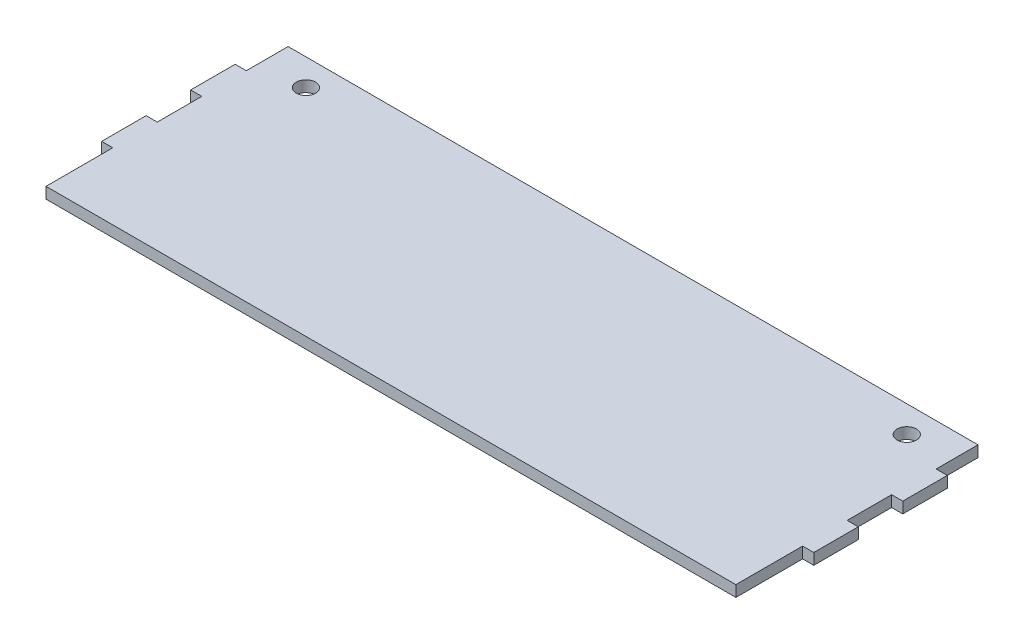
ISO-10303-21;
HEADER;
FILE_DESCRIPTION(('STEP AP214'),'2;1');
FILE_NAME('part.step','',(''),(''),'','','');
FILE_SCHEMA(('AUTOMOTIVE_DESIGN { 1 0 10303 214 1 1 1 1 }'));
ENDSEC;
DATA;
#1=APPLICATION_CONTEXT('core data for automotive mechanical design processes');
#2=APPLICATION_PROTOCOL_DEFINITION('international standard','automotive_design',2000,#1);
#3=PRODUCT_CONTEXT('',#1,'mechanical');
#4=PRODUCT('Part','Part','',(#3));
#5=PRODUCT_RELATED_PRODUCT_CATEGORY('part','',(#4));
#6=PRODUCT_DEFINITION_FORMATION('','',#4);
#7=PRODUCT_DEFINITION_CONTEXT('part definition',#1,'design');
#8=PRODUCT_DEFINITION('design','',#6,#7);
#9=PRODUCT_DEFINITION_SHAPE('','',#8);
#10=(LENGTH_UNIT() NAMED_UNIT(*) SI_UNIT(.MILLI.,.METRE.));
#11=(NAMED_UNIT(*) PLANE_ANGLE_UNIT() SI_UNIT($,.RADIAN.));
#12=(NAMED_UNIT(*) SI_UNIT($,.STERADIAN.) SOLID_ANGLE_UNIT());
#13=UNCERTAINTY_MEASURE_WITH_UNIT(LENGTH_MEASURE(1.E-05),#10,'distance_accuracy_value','');
#14=(GEOMETRIC_REPRESENTATION_CONTEXT(3) GLOBAL_UNCERTAINTY_ASSIGNED_CONTEXT((#13)) GLOBAL_UNIT_ASSIGNED_CONTEXT((#10,
#11,#12)) REPRESENTATION_CONTEXT('',''));
#15=CARTESIAN_POINT('',(0.,0.,0.));
#16=DIRECTION('',(0.,0.,1.));
#17=DIRECTION('',(1.,0.,0.));
#18=AXIS2_PLACEMENT_3D('',#15,#16,#17);
#19=CARTESIAN_POINT('',(0.,3.175,0.));
#20=DIRECTION('',(0.,0.,-1.));
#21=DIRECTION('',(-1.,0.,0.));
#22=AXIS2_PLACEMENT_3D('',#19,#20,#21);
#23=PLANE('',#22);
#24=DIRECTION('',(1.,0.,0.));
#25=VECTOR('',#24,1.);
#26=CARTESIAN_POINT('',(0.,0.,0.));
#27=LINE('',#26,#25);
#28=CARTESIAN_POINT('',(3.175,0.,0.));
#29=VERTEX_POINT('',#28);
#30=CARTESIAN_POINT('',(200.025,0.,0.));
#31=VERTEX_POINT('',#30);
#32=EDGE_CURVE('E245',#29,#31,#27,.T.);
#33=ORIENTED_EDGE('',*,*,#32,.T.);
#34=DIRECTION('',(0.,-1.,0.));
#35=VECTOR('',#34,1.);
#36=CARTESIAN_POINT('',(200.025,3.175,0.));
#37=LINE('',#36,#35);
#38=CARTESIAN_POINT('',(200.025,3.175,0.));
#39=VERTEX_POINT('',#38);
#40=EDGE_CURVE('E11',#39,#31,#37,.T.);
#41=ORIENTED_EDGE('',*,*,#40,.F.);
#42=DIRECTION('',(1.,0.,0.));
#43=VECTOR('',#42,1.);
#44=CARTESIAN_POINT('',(0.,3.175,0.));
#45=LINE('',#44,#43);
#46=CARTESIAN_POINT('',(3.175,3.175,0.));
#47=VERTEX_POINT('',#46);
#48=EDGE_CURVE('E239',#47,#39,#45,.T.);
#49=ORIENTED_EDGE('',*,*,#48,.F.);
#50=DIRECTION('',(0.,-1.,0.));
#51=VECTOR('',#50,1.);
#52=CARTESIAN_POINT('',(3.175,3.175,0.));
#53=LINE('',#52,#51);
#54=EDGE_CURVE('E51',#47,#29,#53,.T.);
#55=ORIENTED_EDGE('',*,*,#54,.T.);
#56=EDGE_LOOP('',(#33,#41,#49,#55));
#57=FACE_BOUND('',#56,.T.);
#58=ADVANCED_FACE('F35',(#57),#23,.F.);
#59=CARTESIAN_POINT('',(200.025,3.175,-5.82867087928207E-13));
#60=DIRECTION('',(-1.,0.,0.));
#61=DIRECTION('',(0.,0.,1.));
#62=AXIS2_PLACEMENT_3D('',#59,#60,#61);
#63=PLANE('',#62);
#64=DIRECTION('',(0.,0.,-1.));
#65=VECTOR('',#64,1.);
#66=CARTESIAN_POINT('',(200.025,0.,-5.82867087928207E-13));
#67=LINE('',#66,#65);
#68=CARTESIAN_POINT('',(200.025,0.,-19.05));
#69=VERTEX_POINT('',#68);
#70=EDGE_CURVE('E287',#31,#69,#67,.T.);
#71=ORIENTED_EDGE('',*,*,#70,.T.);
#72=DIRECTION('',(0.,-1.,0.));
#73=VECTOR('',#72,1.);
#74=CARTESIAN_POINT('',(200.025,3.175,-19.05));
#75=LINE('',#74,#73);
#76=CARTESIAN_POINT('',(200.025,3.175,-19.05));
#77=VERTEX_POINT('',#76);
#78=EDGE_CURVE('E43',#77,#69,#75,.T.);
#79=ORIENTED_EDGE('',*,*,#78,.F.);
#80=DIRECTION('',(0.,0.,-1.));
#81=VECTOR('',#80,1.);
#82=CARTESIAN_POINT('',(200.025,3.175,-5.82867087928207E-13));
#83=LINE('',#82,#81);
#84=EDGE_CURVE('E126',#39,#77,#83,.T.);
#85=ORIENTED_EDGE('',*,*,#84,.F.);
#86=ORIENTED_EDGE('',*,*,#40,.T.);
#87=EDGE_LOOP('',(#71,#79,#85,#86));
#88=FACE_BOUND('',#87,.T.);
#89=ADVANCED_FACE('F279',(#88),#63,.F.);
#90=CARTESIAN_POINT('',(0.,3.175,-19.05));
#91=DIRECTION('',(0.,0.,1.));
#92=DIRECTION('',(1.,0.,0.));
#93=AXIS2_PLACEMENT_3D('',#90,#91,#92);
#94=PLANE('',#93);
#95=DIRECTION('',(-1.,0.,0.));
#96=VECTOR('',#95,1.);
#97=CARTESIAN_POINT('',(0.,0.,-19.05));
#98=LINE('',#97,#96);
#99=CARTESIAN_POINT('',(203.2,0.,-19.05));
#100=VERTEX_POINT('',#99);
#101=EDGE_CURVE('E290',#100,#69,#98,.T.);
#102=ORIENTED_EDGE('',*,*,#101,.F.);
#103=DIRECTION('',(0.,-1.,0.));
#104=VECTOR('',#103,1.);
#105=CARTESIAN_POINT('',(203.2,3.175,-19.05));
#106=LINE('',#105,#104);
#107=CARTESIAN_POINT('',(203.2,3.175,-19.05));
#108=VERTEX_POINT('',#107);
#109=EDGE_CURVE('E369',#108,#100,#106,.T.);
#110=ORIENTED_EDGE('',*,*,#109,.F.);
#111=DIRECTION('',(-1.,0.,0.));
#112=VECTOR('',#111,1.);
#113=CARTESIAN_POINT('',(0.,3.175,-19.05));
#114=LINE('',#113,#112);
#115=EDGE_CURVE('E235',#108,#77,#114,.T.);
#116=ORIENTED_EDGE('',*,*,#115,.T.);
#117=ORIENTED_EDGE('',*,*,#78,.T.);
#118=EDGE_LOOP('',(#102,#110,#116,#117));
#119=FACE_BOUND('',#118,.T.);
#120=ADVANCED_FACE('F283',(#119),#94,.T.);
#121=CARTESIAN_POINT('',(203.2,3.175,0.));
#122=DIRECTION('',(-1.,0.,0.));
#123=DIRECTION('',(0.,0.,1.));
#124=AXIS2_PLACEMENT_3D('',#121,#122,#123);
#125=PLANE('',#124);
#126=DIRECTION('',(0.,0.,-1.));
#127=VECTOR('',#126,1.);
#128=CARTESIAN_POINT('',(203.2,0.,0.));
#129=LINE('',#128,#127);
#130=CARTESIAN_POINT('',(203.2,0.,-31.75));
#131=VERTEX_POINT('',#130);
#132=EDGE_CURVE('E296',#100,#131,#129,.T.);
#133=ORIENTED_EDGE('',*,*,#132,.T.);
#134=DIRECTION('',(0.,-1.,0.));
#135=VECTOR('',#134,1.);
#136=CARTESIAN_POINT('',(203.2,3.175,-31.75));
#137=LINE('',#136,#135);
#138=CARTESIAN_POINT('',(203.2,3.175,-31.75));
#139=VERTEX_POINT('',#138);
#140=EDGE_CURVE('E366',#139,#131,#137,.T.);
#141=ORIENTED_EDGE('',*,*,#140,.F.);
#142=DIRECTION('',(0.,0.,-1.));
#143=VECTOR('',#142,1.);
#144=CARTESIAN_POINT('',(203.2,3.175,0.));
#145=LINE('',#144,#143);
#146=EDGE_CURVE('E233',#108,#139,#145,.T.);
#147=ORIENTED_EDGE('',*,*,#146,.F.);
#148=ORIENTED_EDGE('',*,*,#109,.T.);
#149=EDGE_LOOP('',(#133,#141,#147,#148));
#150=FACE_BOUND('',#149,.T.);
#151=ADVANCED_FACE('F378',(#150),#125,.F.);
#152=CARTESIAN_POINT('',(0.,3.175,-31.7499999999996));
#153=DIRECTION('',(0.,0.,1.));
#154=DIRECTION('',(1.,0.,0.));
#155=AXIS2_PLACEMENT_3D('',#152,#153,#154);
#156=PLANE('',#155);
#157=DIRECTION('',(-1.,0.,0.));
#158=VECTOR('',#157,1.);
#159=CARTESIAN_POINT('',(0.,0.,-31.7499999999996));
#160=LINE('',#159,#158);
#161=CARTESIAN_POINT('',(200.025,0.,-31.75));
#162=VERTEX_POINT('',#161);
#163=EDGE_CURVE('E298',#131,#162,#160,.T.);
#164=ORIENTED_EDGE('',*,*,#163,.T.);
#165=DIRECTION('',(0.,-1.,0.));
#166=VECTOR('',#165,1.);
#167=CARTESIAN_POINT('',(200.025,3.175,-31.75));
#168=LINE('',#167,#166);
#169=CARTESIAN_POINT('',(200.025,3.175,-31.75));
#170=VERTEX_POINT('',#169);
#171=EDGE_CURVE('E363',#170,#162,#168,.T.);
#172=ORIENTED_EDGE('',*,*,#171,.F.);
#173=DIRECTION('',(-1.,0.,0.));
#174=VECTOR('',#173,1.);
#175=CARTESIAN_POINT('',(0.,3.175,-31.7499999999996));
#176=LINE('',#175,#174);
#177=EDGE_CURVE('E231',#139,#170,#176,.T.);
#178=ORIENTED_EDGE('',*,*,#177,.F.);
#179=ORIENTED_EDGE('',*,*,#140,.T.);
#180=EDGE_LOOP('',(#164,#172,#178,#179));
#181=FACE_BOUND('',#180,.T.);
#182=ADVANCED_FACE('F382',(#181),#156,.F.);
#183=CARTESIAN_POINT('',(200.025,3.175,0.));
#184=DIRECTION('',(-1.,0.,0.));
#185=DIRECTION('',(0.,0.,1.));
#186=AXIS2_PLACEMENT_3D('',#183,#184,#185);
#187=PLANE('',#186);
#188=DIRECTION('',(0.,0.,-1.));
#189=VECTOR('',#188,1.);
#190=CARTESIAN_POINT('',(200.025,0.,0.));
#191=LINE('',#190,#189);
#192=CARTESIAN_POINT('',(200.025,0.,-44.45));
#193=VERTEX_POINT('',#192);
#194=EDGE_CURVE('E301',#162,#193,#191,.T.);
#195=ORIENTED_EDGE('',*,*,#194,.T.);
#196=DIRECTION('',(0.,-1.,0.));
#197=VECTOR('',#196,1.);
#198=CARTESIAN_POINT('',(200.025,3.175,-44.45));
#199=LINE('',#198,#197);
#200=CARTESIAN_POINT('',(200.025,3.175,-44.45));
#201=VERTEX_POINT('',#200);
#202=EDGE_CURVE('E361',#201,#193,#199,.T.);
#203=ORIENTED_EDGE('',*,*,#202,.F.);
#204=DIRECTION('',(0.,0.,-1.));
#205=VECTOR('',#204,1.);
#206=CARTESIAN_POINT('',(200.025,3.175,0.));
#207=LINE('',#206,#205);
#208=EDGE_CURVE('E229',#170,#201,#207,.T.);
#209=ORIENTED_EDGE('',*,*,#208,.F.);
#210=ORIENTED_EDGE('',*,*,#171,.T.);
#211=EDGE_LOOP('',(#195,#203,#209,#210));
#212=FACE_BOUND('',#211,.T.);
#213=ADVANCED_FACE('F435',(#212),#187,.F.);
#214=CARTESIAN_POINT('',(0.,3.175,-44.4499999999996));
#215=DIRECTION('',(0.,0.,1.));
#216=DIRECTION('',(1.,0.,0.));
#217=AXIS2_PLACEMENT_3D('',#214,#215,#216);
#218=PLANE('',#217);
#219=DIRECTION('',(-1.,0.,0.));
#220=VECTOR('',#219,1.);
#221=CARTESIAN_POINT('',(0.,0.,-44.4499999999996));
#222=LINE('',#221,#220);
#223=CARTESIAN_POINT('',(203.2,0.,-44.45));
#224=VERTEX_POINT('',#223);
#225=EDGE_CURVE('E304',#224,#193,#222,.T.);
#226=ORIENTED_EDGE('',*,*,#225,.F.);
#227=DIRECTION('',(0.,-1.,0.));
#228=VECTOR('',#227,1.);
#229=CARTESIAN_POINT('',(203.2,3.175,-44.45));
#230=LINE('',#229,#228);
#231=CARTESIAN_POINT('',(203.2,3.175,-44.45));
#232=VERTEX_POINT('',#231);
#233=EDGE_CURVE('E359',#232,#224,#230,.T.);
#234=ORIENTED_EDGE('',*,*,#233,.F.);
#235=DIRECTION('',(-1.,0.,0.));
#236=VECTOR('',#235,1.);
#237=CARTESIAN_POINT('',(0.,3.175,-44.4499999999996));
#238=LINE('',#237,#236);
#239=EDGE_CURVE('E226',#232,#201,#238,.T.);
#240=ORIENTED_EDGE('',*,*,#239,.T.);
#241=ORIENTED_EDGE('',*,*,#202,.T.);
#242=EDGE_LOOP('',(#226,#234,#240,#241));
#243=FACE_BOUND('',#242,.T.);
#244=ADVANCED_FACE('F431',(#243),#218,.T.);
#245=CARTESIAN_POINT('',(203.2,0.,-57.15));
#246=VERTEX_POINT('',#245);
#247=EDGE_CURVE('E299',#224,#246,#129,.T.);
#248=ORIENTED_EDGE('',*,*,#247,.T.);
#249=DIRECTION('',(0.,-1.,0.));
#250=VECTOR('',#249,1.);
#251=CARTESIAN_POINT('',(203.2,3.175,-57.15));
#252=LINE('',#251,#250);
#253=CARTESIAN_POINT('',(203.2,3.175,-57.15));
#254=VERTEX_POINT('',#253);
#255=EDGE_CURVE('E356',#254,#246,#252,.T.);
#256=ORIENTED_EDGE('',*,*,#255,.F.);
#257=EDGE_CURVE('E225',#232,#254,#145,.T.);
#258=ORIENTED_EDGE('',*,*,#257,.F.);
#259=ORIENTED_EDGE('',*,*,#233,.T.);
#260=EDGE_LOOP('',(#248,#256,#258,#259));
#261=FACE_BOUND('',#260,.T.);
#262=ADVANCED_FACE('F427',(#261),#125,.F.);
#263=CARTESIAN_POINT('',(-1.24900090270329E-13,3.175,-57.1499999999996));
#264=DIRECTION('',(0.,0.,1.));
#265=DIRECTION('',(1.,0.,0.));
#266=AXIS2_PLACEMENT_3D('',#263,#264,#265);
#267=PLANE('',#266);
#268=DIRECTION('',(-1.,0.,0.));
#269=VECTOR('',#268,1.);
#270=CARTESIAN_POINT('',(-1.24900090270329E-13,0.,-57.1499999999996));
#271=LINE('',#270,#269);
#272=CARTESIAN_POINT('',(200.025,0.,-57.15));
#273=VERTEX_POINT('',#272);
#274=EDGE_CURVE('E307',#246,#273,#271,.T.);
#275=ORIENTED_EDGE('',*,*,#274,.T.);
#276=DIRECTION('',(0.,-1.,0.));
#277=VECTOR('',#276,1.);
#278=CARTESIAN_POINT('',(200.025,3.175,-57.15));
#279=LINE('',#278,#277);
#280=CARTESIAN_POINT('',(200.025,3.175,-57.15));
#281=VERTEX_POINT('',#280);
#282=EDGE_CURVE('E353',#281,#273,#279,.T.);
#283=ORIENTED_EDGE('',*,*,#282,.F.);
#284=DIRECTION('',(-1.,0.,0.));
#285=VECTOR('',#284,1.);
#286=CARTESIAN_POINT('',(-1.24900090270329E-13,3.175,-57.1499999999996));
#287=LINE('',#286,#285);
#288=EDGE_CURVE('E223',#254,#281,#287,.T.);
#289=ORIENTED_EDGE('',*,*,#288,.F.);
#290=ORIENTED_EDGE('',*,*,#255,.T.);
#291=EDGE_LOOP('',(#275,#283,#289,#290));
#292=FACE_BOUND('',#291,.T.);
#293=ADVANCED_FACE('F423',(#292),#267,.F.);
#294=CARTESIAN_POINT('',(200.025,3.175,0.));
#295=DIRECTION('',(-1.,0.,0.));
#296=DIRECTION('',(0.,0.,1.));
#297=AXIS2_PLACEMENT_3D('',#294,#295,#296);
#298=PLANE('',#297);
#299=DIRECTION('',(0.,0.,-1.));
#300=VECTOR('',#299,1.);
#301=CARTESIAN_POINT('',(200.025,0.,0.));
#302=LINE('',#301,#300);
#303=CARTESIAN_POINT('',(200.025,0.,-69.088));
#304=VERTEX_POINT('',#303);
#305=EDGE_CURVE('E309',#273,#304,#302,.T.);
#306=ORIENTED_EDGE('',*,*,#305,.T.);
#307=DIRECTION('',(0.,-1.,0.));
#308=VECTOR('',#307,1.);
#309=CARTESIAN_POINT('',(200.025,3.175,-69.088));
#310=LINE('',#309,#308);
#311=CARTESIAN_POINT('',(200.025,3.175,-69.088));
#312=VERTEX_POINT('',#311);
#313=EDGE_CURVE('E351',#312,#304,#310,.T.);
#314=ORIENTED_EDGE('',*,*,#313,.F.);
#315=DIRECTION('',(0.,0.,-1.));
#316=VECTOR('',#315,1.);
#317=CARTESIAN_POINT('',(200.025,3.175,0.));
#318=LINE('',#317,#316);
#319=EDGE_CURVE('E221',#281,#312,#318,.T.);
#320=ORIENTED_EDGE('',*,*,#319,.F.);
#321=ORIENTED_EDGE('',*,*,#282,.T.);
#322=EDGE_LOOP('',(#306,#314,#320,#321));
#323=FACE_BOUND('',#322,.T.);
#324=ADVANCED_FACE('F419',(#323),#298,.F.);
#325=CARTESIAN_POINT('',(0.,3.175,-69.088));
#326=DIRECTION('',(0.,0.,-1.));
#327=DIRECTION('',(-1.,0.,0.));
#328=AXIS2_PLACEMENT_3D('',#325,#326,#327);
#329=PLANE('',#328);
#330=DIRECTION('',(1.,0.,0.));
#331=VECTOR('',#330,1.);
#332=CARTESIAN_POINT('',(0.,0.,-69.088));
#333=LINE('',#332,#331);
#334=CARTESIAN_POINT('',(3.17499999999999,0.,-69.088));
#335=VERTEX_POINT('',#334);
#336=EDGE_CURVE('E312',#335,#304,#333,.T.);
#337=ORIENTED_EDGE('',*,*,#336,.F.);
#338=DIRECTION('',(0.,-1.,0.));
#339=VECTOR('',#338,1.);
#340=CARTESIAN_POINT('',(3.17499999999999,3.175,-69.088));
#341=LINE('',#340,#339);
#342=CARTESIAN_POINT('',(3.17499999999999,3.175,-69.088));
#343=VERTEX_POINT('',#342);
#344=EDGE_CURVE('E349',#343,#335,#341,.T.);
#345=ORIENTED_EDGE('',*,*,#344,.F.);
#346=DIRECTION('',(1.,0.,0.));
#347=VECTOR('',#346,1.);
#348=CARTESIAN_POINT('',(0.,3.175,-69.088));
#349=LINE('',#348,#347);
#350=EDGE_CURVE('E216',#343,#312,#349,.T.);
#351=ORIENTED_EDGE('',*,*,#350,.T.);
#352=ORIENTED_EDGE('',*,*,#313,.T.);
#353=EDGE_LOOP('',(#337,#345,#351,#352));
#354=FACE_BOUND('',#353,.T.);
#355=ADVANCED_FACE('F415',(#354),#329,.T.);
#356=CARTESIAN_POINT('',(3.17499999999999,3.175,0.));
#357=DIRECTION('',(-1.,0.,0.));
#358=DIRECTION('',(0.,0.,1.));
#359=AXIS2_PLACEMENT_3D('',#356,#357,#358);
#360=PLANE('',#359);
#361=DIRECTION('',(0.,0.,-1.));
#362=VECTOR('',#361,1.);
#363=CARTESIAN_POINT('',(3.17499999999999,0.,0.));
#364=LINE('',#363,#362);
#365=CARTESIAN_POINT('',(3.17499999999999,0.,-57.15));
#366=VERTEX_POINT('',#365);
#367=EDGE_CURVE('E315',#366,#335,#364,.T.);
#368=ORIENTED_EDGE('',*,*,#367,.F.);
#369=DIRECTION('',(0.,-1.,0.));
#370=VECTOR('',#369,1.);
#371=CARTESIAN_POINT('',(3.17499999999999,3.175,-57.15));
#372=LINE('',#371,#370);
#373=CARTESIAN_POINT('',(3.17499999999999,3.175,-57.15));
#374=VERTEX_POINT('',#373);
#375=EDGE_CURVE('E347',#374,#366,#372,.T.);
#376=ORIENTED_EDGE('',*,*,#375,.F.);
#377=DIRECTION('',(0.,0.,-1.));
#378=VECTOR('',#377,1.);
#379=CARTESIAN_POINT('',(3.17499999999999,3.175,0.));
#380=LINE('',#379,#378);
#381=EDGE_CURVE('E212',#374,#343,#380,.T.);
#382=ORIENTED_EDGE('',*,*,#381,.T.);
#383=ORIENTED_EDGE('',*,*,#344,.T.);
#384=EDGE_LOOP('',(#368,#376,#382,#383));
#385=FACE_BOUND('',#384,.T.);
#386=ADVANCED_FACE('F412',(#385),#360,.T.);
#387=CARTESIAN_POINT('',(0.,3.175,-57.15));
#388=DIRECTION('',(0.,0.,-1.));
#389=DIRECTION('',(-1.,0.,0.));
#390=AXIS2_PLACEMENT_3D('',#387,#388,#389);
#391=PLANE('',#390);
#392=DIRECTION('',(1.,0.,0.));
#393=VECTOR('',#392,1.);
#394=CARTESIAN_POINT('',(0.,0.,-57.15));
#395=LINE('',#394,#393);
#396=CARTESIAN_POINT('',(0.,0.,-57.15));
#397=VERTEX_POINT('',#396);
#398=EDGE_CURVE('E318',#397,#366,#395,.T.);
#399=ORIENTED_EDGE('',*,*,#398,.F.);
#400=DIRECTION('',(0.,-1.,0.));
#401=VECTOR('',#400,1.);
#402=CARTESIAN_POINT('',(0.,3.175,-57.15));
#403=LINE('',#402,#401);
#404=CARTESIAN_POINT('',(0.,3.175,-57.15));
#405=VERTEX_POINT('',#404);
#406=EDGE_CURVE('E345',#405,#397,#403,.T.);
#407=ORIENTED_EDGE('',*,*,#406,.F.);
#408=DIRECTION('',(1.,0.,0.));
#409=VECTOR('',#408,1.);
#410=CARTESIAN_POINT('',(0.,3.175,-57.15));
#411=LINE('',#410,#409);
#412=EDGE_CURVE('E208',#405,#374,#411,.T.);
#413=ORIENTED_EDGE('',*,*,#412,.T.);
#414=ORIENTED_EDGE('',*,*,#375,.T.);
#415=EDGE_LOOP('',(#399,#407,#413,#414));
#416=FACE_BOUND('',#415,.T.);
#417=ADVANCED_FACE('F409',(#416),#391,.T.);
#418=CARTESIAN_POINT('',(0.,3.175,0.));
#419=DIRECTION('',(-1.,0.,0.));
#420=DIRECTION('',(0.,0.,1.));
#421=AXIS2_PLACEMENT_3D('',#418,#419,#420);
#422=PLANE('',#421);
#423=DIRECTION('',(0.,0.,-1.));
#424=VECTOR('',#423,1.);
#425=CARTESIAN_POINT('',(0.,0.,0.));
#426=LINE('',#425,#424);
#427=CARTESIAN_POINT('',(0.,0.,-44.45));
#428=VERTEX_POINT('',#427);
#429=EDGE_CURVE('E321',#428,#397,#426,.T.);
#430=ORIENTED_EDGE('',*,*,#429,.F.);
#431=DIRECTION('',(0.,-1.,0.));
#432=VECTOR('',#431,1.);
#433=CARTESIAN_POINT('',(0.,3.175,-44.45));
#434=LINE('',#433,#432);
#435=CARTESIAN_POINT('',(0.,3.175,-44.45));
#436=VERTEX_POINT('',#435);
#437=EDGE_CURVE('E343',#436,#428,#434,.T.);
#438=ORIENTED_EDGE('',*,*,#437,.F.);
#439=DIRECTION('',(0.,0.,-1.));
#440=VECTOR('',#439,1.);
#441=CARTESIAN_POINT('',(0.,3.175,0.));
#442=LINE('',#441,#440);
#443=EDGE_CURVE('E201',#436,#405,#442,.T.);
#444=ORIENTED_EDGE('',*,*,#443,.T.);
#445=ORIENTED_EDGE('',*,*,#406,.T.);
#446=EDGE_LOOP('',(#430,#438,#444,#445));
#447=FACE_BOUND('',#446,.T.);
#448=ADVANCED_FACE('F397',(#447),#422,.T.);
#449=CARTESIAN_POINT('',(0.,3.175,-44.45));
#450=DIRECTION('',(0.,0.,-1.));
#451=DIRECTION('',(-1.,0.,0.));
#452=AXIS2_PLACEMENT_3D('',#449,#450,#451);
#453=PLANE('',#452);
#454=DIRECTION('',(1.,0.,0.));
#455=VECTOR('',#454,1.);
#456=CARTESIAN_POINT('',(0.,0.,-44.45));
#457=LINE('',#456,#455);
#458=CARTESIAN_POINT('',(3.17499999999999,0.,-44.45));
#459=VERTEX_POINT('',#458);
#460=EDGE_CURVE('E324',#428,#459,#457,.T.);
#461=ORIENTED_EDGE('',*,*,#460,.T.);
#462=DIRECTION('',(0.,-1.,0.));
#463=VECTOR('',#462,1.);
#464=CARTESIAN_POINT('',(3.17499999999999,3.175,-44.45));
#465=LINE('',#464,#463);
#466=CARTESIAN_POINT('',(3.17499999999999,3.175,-44.45));
#467=VERTEX_POINT('',#466);
#468=EDGE_CURVE('E341',#467,#459,#465,.T.);
#469=ORIENTED_EDGE('',*,*,#468,.F.);
#470=DIRECTION('',(1.,0.,0.));
#471=VECTOR('',#470,1.);
#472=CARTESIAN_POINT('',(0.,3.175,-44.45));
#473=LINE('',#472,#471);
#474=EDGE_CURVE('E207',#436,#467,#473,.T.);
#475=ORIENTED_EDGE('',*,*,#474,.F.);
#476=ORIENTED_EDGE('',*,*,#437,.T.);
#477=EDGE_LOOP('',(#461,#469,#475,#476));
#478=FACE_BOUND('',#477,.T.);
#479=ADVANCED_FACE('F404',(#478),#453,.F.);
#480=CARTESIAN_POINT('',(3.17499999999999,3.175,0.));
#481=DIRECTION('',(-1.,0.,0.));
#482=DIRECTION('',(0.,0.,1.));
#483=AXIS2_PLACEMENT_3D('',#480,#481,#482);
#484=PLANE('',#483);
#485=DIRECTION('',(0.,0.,-1.));
#486=VECTOR('',#485,1.);
#487=CARTESIAN_POINT('',(3.17499999999999,0.,0.));
#488=LINE('',#487,#486);
#489=CARTESIAN_POINT('',(3.17499999999999,0.,-31.75));
#490=VERTEX_POINT('',#489);
#491=EDGE_CURVE('E327',#490,#459,#488,.T.);
#492=ORIENTED_EDGE('',*,*,#491,.F.);
#493=DIRECTION('',(0.,-1.,0.));
#494=VECTOR('',#493,1.);
#495=CARTESIAN_POINT('',(3.17499999999999,3.175,-31.75));
#496=LINE('',#495,#494);
#497=CARTESIAN_POINT('',(3.17499999999999,3.175,-31.75));
#498=VERTEX_POINT('',#497);
#499=EDGE_CURVE('E339',#498,#490,#496,.T.);
#500=ORIENTED_EDGE('',*,*,#499,.F.);
#501=DIRECTION('',(0.,0.,-1.));
#502=VECTOR('',#501,1.);
#503=CARTESIAN_POINT('',(3.17499999999999,3.175,0.));
#504=LINE('',#503,#502);
#505=EDGE_CURVE('E202',#498,#467,#504,.T.);
#506=ORIENTED_EDGE('',*,*,#505,.T.);
#507=ORIENTED_EDGE('',*,*,#468,.T.);
#508=EDGE_LOOP('',(#492,#500,#506,#507));
#509=FACE_BOUND('',#508,.T.);
#510=ADVANCED_FACE('F400',(#509),#484,.T.);
#511=CARTESIAN_POINT('',(0.,3.175,-31.75));
#512=DIRECTION('',(0.,0.,-1.));
#513=DIRECTION('',(-1.,0.,0.));
#514=AXIS2_PLACEMENT_3D('',#511,#512,#513);
#515=PLANE('',#514);
#516=DIRECTION('',(1.,0.,0.));
#517=VECTOR('',#516,1.);
#518=CARTESIAN_POINT('',(0.,0.,-31.75));
#519=LINE('',#518,#517);
#520=CARTESIAN_POINT('',(0.,0.,-31.75));
#521=VERTEX_POINT('',#520);
#522=EDGE_CURVE('E330',#521,#490,#519,.T.);
#523=ORIENTED_EDGE('',*,*,#522,.F.);
#524=DIRECTION('',(0.,-1.,0.));
#525=VECTOR('',#524,1.);
#526=CARTESIAN_POINT('',(0.,3.175,-31.75));
#527=LINE('',#526,#525);
#528=CARTESIAN_POINT('',(0.,3.175,-31.75));
#529=VERTEX_POINT('',#528);
#530=EDGE_CURVE('E187',#529,#521,#527,.T.);
#531=ORIENTED_EDGE('',*,*,#530,.F.);
#532=DIRECTION('',(1.,0.,0.));
#533=VECTOR('',#532,1.);
#534=CARTESIAN_POINT('',(0.,3.175,-31.75));
#535=LINE('',#534,#533);
#536=EDGE_CURVE('E199',#529,#498,#535,.T.);
#537=ORIENTED_EDGE('',*,*,#536,.T.);
#538=ORIENTED_EDGE('',*,*,#499,.T.);
#539=EDGE_LOOP('',(#523,#531,#537,#538));
#540=FACE_BOUND('',#539,.T.);
#541=ADVANCED_FACE('F396',(#540),#515,.T.);
#542=CARTESIAN_POINT('',(0.,0.,-19.05));
#543=VERTEX_POINT('',#542);
#544=EDGE_CURVE('E184',#543,#521,#426,.T.);
#545=ORIENTED_EDGE('',*,*,#544,.F.);
#546=DIRECTION('',(0.,-1.,0.));
#547=VECTOR('',#546,1.);
#548=CARTESIAN_POINT('',(0.,3.175,-19.05));
#549=LINE('',#548,#547);
#550=CARTESIAN_POINT('',(0.,3.175,-19.05));
#551=VERTEX_POINT('',#550);
#552=EDGE_CURVE('E178',#551,#543,#549,.T.);
#553=ORIENTED_EDGE('',*,*,#552,.F.);
#554=EDGE_CURVE('E182',#551,#529,#442,.T.);
#555=ORIENTED_EDGE('',*,*,#554,.T.);
#556=ORIENTED_EDGE('',*,*,#530,.T.);
#557=EDGE_LOOP('',(#545,#553,#555,#556));
#558=FACE_BOUND('',#557,.T.);
#559=ADVANCED_FACE('F180',(#558),#422,.T.);
#560=CARTESIAN_POINT('',(0.,3.175,-19.05));
#561=DIRECTION('',(0.,0.,-1.));
#562=DIRECTION('',(-1.,0.,0.));
#563=AXIS2_PLACEMENT_3D('',#560,#561,#562);
#564=PLANE('',#563);
#565=DIRECTION('',(1.,0.,0.));
#566=VECTOR('',#565,1.);
#567=CARTESIAN_POINT('',(0.,0.,-19.05));
#568=LINE('',#567,#566);
#569=CARTESIAN_POINT('',(3.175,0.,-19.05));
#570=VERTEX_POINT('',#569);
#571=EDGE_CURVE('E333',#543,#570,#568,.T.);
#572=ORIENTED_EDGE('',*,*,#571,.T.);
#573=DIRECTION('',(0.,-1.,0.));
#574=VECTOR('',#573,1.);
#575=CARTESIAN_POINT('',(3.175,3.175,-19.05));
#576=LINE('',#575,#574);
#577=CARTESIAN_POINT('',(3.175,3.175,-19.05));
#578=VERTEX_POINT('',#577);
#579=EDGE_CURVE('E114',#578,#570,#576,.T.);
#580=ORIENTED_EDGE('',*,*,#579,.F.);
#581=DIRECTION('',(1.,0.,0.));
#582=VECTOR('',#581,1.);
#583=CARTESIAN_POINT('',(0.,3.175,-19.05));
#584=LINE('',#583,#582);
#585=EDGE_CURVE('E189',#551,#578,#584,.T.);
#586=ORIENTED_EDGE('',*,*,#585,.F.);
#587=ORIENTED_EDGE('',*,*,#552,.T.);
#588=EDGE_LOOP('',(#572,#580,#586,#587));
#589=FACE_BOUND('',#588,.T.);
#590=ADVANCED_FACE('F190',(#589),#564,.F.);
#591=CARTESIAN_POINT('',(3.175,3.175,0.));
#592=DIRECTION('',(-1.,0.,0.));
#593=DIRECTION('',(0.,0.,1.));
#594=AXIS2_PLACEMENT_3D('',#591,#592,#593);
#595=PLANE('',#594);
#596=DIRECTION('',(0.,0.,-1.));
#597=VECTOR('',#596,1.);
#598=CARTESIAN_POINT('',(3.175,0.,0.));
#599=LINE('',#598,#597);
#600=EDGE_CURVE('E241',#29,#570,#599,.T.);
#601=ORIENTED_EDGE('',*,*,#600,.F.);
#602=ORIENTED_EDGE('',*,*,#54,.F.);
#603=DIRECTION('',(0.,0.,-1.));
#604=VECTOR('',#603,1.);
#605=CARTESIAN_POINT('',(3.175,3.175,0.));
#606=LINE('',#605,#604);
#607=EDGE_CURVE('E193',#47,#578,#606,.T.);
#608=ORIENTED_EDGE('',*,*,#607,.T.);
#609=ORIENTED_EDGE('',*,*,#579,.T.);
#610=EDGE_LOOP('',(#601,#602,#608,#609));
#611=FACE_BOUND('',#610,.T.);
#612=ADVANCED_FACE('F261',(#611),#595,.T.);
#613=CARTESIAN_POINT('',(0.,3.175,0.));
#614=DIRECTION('',(0.,1.,0.));
#615=DIRECTION('',(0.,0.,1.));
#616=AXIS2_PLACEMENT_3D('',#613,#614,#615);
#617=PLANE('',#616);
#618=CARTESIAN_POINT('',(15.875,3.175,-61.468));
#619=DIRECTION('',(0.,1.,0.));
#620=DIRECTION('',(0.,0.,1.));
#621=AXIS2_PLACEMENT_3D('',#618,#619,#620);
#622=CIRCLE('',#621,2.74999999999999);
#623=CARTESIAN_POINT('',(15.875,3.175,-58.718));
#624=VERTEX_POINT('',#623);
#625=EDGE_CURVE('E252',#624,#624,#622,.T.);
#626=ORIENTED_EDGE('',*,*,#625,.F.);
#627=EDGE_LOOP('',(#626));
#628=FACE_BOUND('',#627,.T.);
#629=CARTESIAN_POINT('',(187.325,3.175,-61.468));
#630=DIRECTION('',(0.,1.,0.));
#631=DIRECTION('',(0.,0.,1.));
#632=AXIS2_PLACEMENT_3D('',#629,#630,#631);
#633=CIRCLE('',#632,2.74999999999997);
#634=CARTESIAN_POINT('',(187.325,3.175,-58.718));
#635=VERTEX_POINT('',#634);
#636=EDGE_CURVE('E246',#635,#635,#633,.T.);
#637=ORIENTED_EDGE('',*,*,#636,.F.);
#638=EDGE_LOOP('',(#637));
#639=FACE_BOUND('',#638,.T.);
#640=ORIENTED_EDGE('',*,*,#48,.T.);
#641=ORIENTED_EDGE('',*,*,#84,.T.);
#642=ORIENTED_EDGE('',*,*,#115,.F.);
#643=ORIENTED_EDGE('',*,*,#146,.T.);
#644=ORIENTED_EDGE('',*,*,#177,.T.);
#645=ORIENTED_EDGE('',*,*,#208,.T.);
#646=ORIENTED_EDGE('',*,*,#239,.F.);
#647=ORIENTED_EDGE('',*,*,#257,.T.);
#648=ORIENTED_EDGE('',*,*,#288,.T.);
#649=ORIENTED_EDGE('',*,*,#319,.T.);
#650=ORIENTED_EDGE('',*,*,#350,.F.);
#651=ORIENTED_EDGE('',*,*,#381,.F.);
#652=ORIENTED_EDGE('',*,*,#412,.F.);
#653=ORIENTED_EDGE('',*,*,#443,.F.);
#654=ORIENTED_EDGE('',*,*,#474,.T.);
#655=ORIENTED_EDGE('',*,*,#505,.F.);
#656=ORIENTED_EDGE('',*,*,#536,.F.);
#657=ORIENTED_EDGE('',*,*,#554,.F.);
#658=ORIENTED_EDGE('',*,*,#585,.T.);
#659=ORIENTED_EDGE('',*,*,#607,.F.);
#660=EDGE_LOOP('',(#640,#641,#642,#643,#644,#645,#646,#647,#648,#649,#650,#651,#652,#653,#654,
#655,#656,#657,#658,#659));
#661=FACE_BOUND('',#660,.T.);
#662=ADVANCED_FACE('F196',(#628,#639,#661),#617,.T.);
#663=CARTESIAN_POINT('',(0.,0.,0.));
#664=DIRECTION('',(0.,1.,0.));
#665=DIRECTION('',(0.,0.,1.));
#666=AXIS2_PLACEMENT_3D('',#663,#664,#665);
#667=PLANE('',#666);
#668=CARTESIAN_POINT('',(15.875,0.,-61.468));
#669=DIRECTION('',(0.,1.,0.));
#670=DIRECTION('',(0.,0.,1.));
#671=AXIS2_PLACEMENT_3D('',#668,#669,#670);
#672=CIRCLE('',#671,2.75);
#673=CARTESIAN_POINT('',(15.875,0.,-58.718));
#674=VERTEX_POINT('',#673);
#675=EDGE_CURVE('E249',#674,#674,#672,.T.);
#676=ORIENTED_EDGE('',*,*,#675,.T.);
#677=EDGE_LOOP('',(#676));
#678=FACE_BOUND('',#677,.T.);
#679=CARTESIAN_POINT('',(187.325,0.,-61.468));
#680=DIRECTION('',(0.,1.,0.));
#681=DIRECTION('',(0.,0.,1.));
#682=AXIS2_PLACEMENT_3D('',#679,#680,#681);
#683=CIRCLE('',#682,2.75);
#684=CARTESIAN_POINT('',(187.325,0.,-58.718));
#685=VERTEX_POINT('',#684);
#686=EDGE_CURVE('E242',#685,#685,#683,.T.);
#687=ORIENTED_EDGE('',*,*,#686,.T.);
#688=EDGE_LOOP('',(#687));
#689=FACE_BOUND('',#688,.T.);
#690=ORIENTED_EDGE('',*,*,#32,.F.);
#691=ORIENTED_EDGE('',*,*,#600,.T.);
#692=ORIENTED_EDGE('',*,*,#571,.F.);
#693=ORIENTED_EDGE('',*,*,#544,.T.);
#694=ORIENTED_EDGE('',*,*,#522,.T.);
#695=ORIENTED_EDGE('',*,*,#491,.T.);
#696=ORIENTED_EDGE('',*,*,#460,.F.);
#697=ORIENTED_EDGE('',*,*,#429,.T.);
#698=ORIENTED_EDGE('',*,*,#398,.T.);
#699=ORIENTED_EDGE('',*,*,#367,.T.);
#700=ORIENTED_EDGE('',*,*,#336,.T.);
#701=ORIENTED_EDGE('',*,*,#305,.F.);
#702=ORIENTED_EDGE('',*,*,#274,.F.);
#703=ORIENTED_EDGE('',*,*,#247,.F.);
#704=ORIENTED_EDGE('',*,*,#225,.T.);
#705=ORIENTED_EDGE('',*,*,#194,.F.);
#706=ORIENTED_EDGE('',*,*,#163,.F.);
#707=ORIENTED_EDGE('',*,*,#132,.F.);
#708=ORIENTED_EDGE('',*,*,#101,.T.);
#709=ORIENTED_EDGE('',*,*,#70,.F.);
#710=EDGE_LOOP('',(#690,#691,#692,#693,#694,#695,#696,#697,#698,#699,#700,#701,#702,#703,#704,
#705,#706,#707,#708,#709));
#711=FACE_BOUND('',#710,.T.);
#712=ADVANCED_FACE('F260',(#678,#689,#711),#667,.F.);
#713=CARTESIAN_POINT('',(187.325,3.175,-61.468));
#714=DIRECTION('',(0.,1.,0.));
#715=DIRECTION('',(0.,0.,1.));
#716=AXIS2_PLACEMENT_3D('',#713,#714,#715);
#717=CYLINDRICAL_SURFACE('',#716,2.74999999999999);
#718=ORIENTED_EDGE('',*,*,#686,.F.);
#719=EDGE_LOOP('',(#718));
#720=FACE_BOUND('',#719,.T.);
#721=ORIENTED_EDGE('',*,*,#636,.T.);
#722=EDGE_LOOP('',(#721));
#723=FACE_BOUND('',#722,.T.);
#724=ADVANCED_FACE('F265',(#720,#723),#717,.F.);
#725=CARTESIAN_POINT('',(15.875,3.175,-61.468));
#726=DIRECTION('',(0.,1.,0.));
#727=DIRECTION('',(0.,0.,1.));
#728=AXIS2_PLACEMENT_3D('',#725,#726,#727);
#729=CYLINDRICAL_SURFACE('',#728,2.74999999999999);
#730=ORIENTED_EDGE('',*,*,#675,.F.);
#731=EDGE_LOOP('',(#730));
#732=FACE_BOUND('',#731,.T.);
#733=ORIENTED_EDGE('',*,*,#625,.T.);
#734=EDGE_LOOP('',(#733));
#735=FACE_BOUND('',#734,.T.);
#736=ADVANCED_FACE('F256',(#732,#735),#729,.F.);
#737=CLOSED_SHELL('',(#58,#89,#120,#151,#182,#213,#244,#262,#293,#324,#355,#386,#417,#448,#479,
#510,#541,#559,#590,#612,#662,#712,#724,#736));
#738=MANIFOLD_SOLID_BREP('B2',#737);
#739=ADVANCED_BREP_SHAPE_REPRESENTATION('',(#18,#738),#14);
#740=SHAPE_DEFINITION_REPRESENTATION(#9,#739);
ENDSEC;
END-ISO-10303-21;
